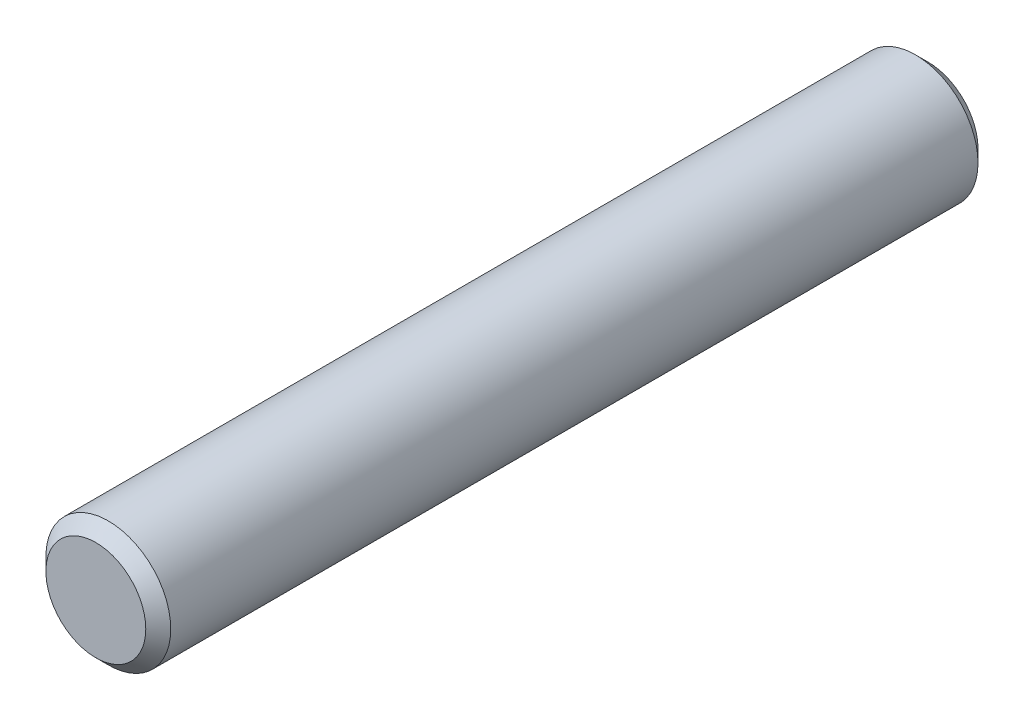
ISO-10303-21;
HEADER;
FILE_DESCRIPTION(('STEP AP214'),'2;1');
FILE_NAME('part.step','',(''),(''),'','','');
FILE_SCHEMA(('AUTOMOTIVE_DESIGN { 1 0 10303 214 1 1 1 1 }'));
ENDSEC;
DATA;
#1=APPLICATION_CONTEXT('core data for automotive mechanical design processes');
#2=APPLICATION_PROTOCOL_DEFINITION('international standard','automotive_design',2000,#1);
#3=PRODUCT_CONTEXT('',#1,'mechanical');
#4=PRODUCT('Part','Part','',(#3));
#5=PRODUCT_RELATED_PRODUCT_CATEGORY('part','',(#4));
#6=PRODUCT_DEFINITION_FORMATION('','',#4);
#7=PRODUCT_DEFINITION_CONTEXT('part definition',#1,'design');
#8=PRODUCT_DEFINITION('design','',#6,#7);
#9=PRODUCT_DEFINITION_SHAPE('','',#8);
#10=(LENGTH_UNIT() NAMED_UNIT(*) SI_UNIT(.MILLI.,.METRE.));
#11=(NAMED_UNIT(*) PLANE_ANGLE_UNIT() SI_UNIT($,.RADIAN.));
#12=(NAMED_UNIT(*) SI_UNIT($,.STERADIAN.) SOLID_ANGLE_UNIT());
#13=UNCERTAINTY_MEASURE_WITH_UNIT(LENGTH_MEASURE(1.E-05),#10,'distance_accuracy_value','');
#14=(GEOMETRIC_REPRESENTATION_CONTEXT(3) GLOBAL_UNCERTAINTY_ASSIGNED_CONTEXT((#13)) GLOBAL_UNIT_ASSIGNED_CONTEXT((#10,
#11,#12)) REPRESENTATION_CONTEXT('',''));
#15=CARTESIAN_POINT('',(0.,0.,0.));
#16=DIRECTION('',(0.,0.,1.));
#17=DIRECTION('',(1.,0.,0.));
#18=AXIS2_PLACEMENT_3D('',#15,#16,#17);
#19=CARTESIAN_POINT('',(0.,0.,10.));
#20=DIRECTION('',(0.,0.,-1.));
#21=DIRECTION('',(-1.,0.,0.));
#22=AXIS2_PLACEMENT_3D('',#19,#20,#21);
#23=CYLINDRICAL_SURFACE('',#22,1.5);
#24=CARTESIAN_POINT('',(0.,0.,-9.7));
#25=DIRECTION('',(0.,0.,1.));
#26=DIRECTION('',(1.,0.,0.));
#27=AXIS2_PLACEMENT_3D('',#24,#25,#26);
#28=CIRCLE('',#27,1.5);
#29=CARTESIAN_POINT('',(1.5,0.,-9.7));
#30=VERTEX_POINT('',#29);
#31=EDGE_CURVE('E53',#30,#30,#28,.T.);
#32=ORIENTED_EDGE('',*,*,#31,.T.);
#33=EDGE_LOOP('',(#32));
#34=FACE_BOUND('',#33,.T.);
#35=CARTESIAN_POINT('',(0.,0.,9.7));
#36=DIRECTION('',(0.,0.,1.));
#37=DIRECTION('',(1.,0.,0.));
#38=AXIS2_PLACEMENT_3D('',#35,#36,#37);
#39=CIRCLE('',#38,1.5);
#40=CARTESIAN_POINT('',(1.5,0.,9.7));
#41=VERTEX_POINT('',#40);
#42=EDGE_CURVE('E58',#41,#41,#39,.F.);
#43=ORIENTED_EDGE('',*,*,#42,.T.);
#44=EDGE_LOOP('',(#43));
#45=FACE_BOUND('',#44,.T.);
#46=ADVANCED_FACE('F39',(#34,#45),#23,.T.);
#47=CARTESIAN_POINT('',(0.,0.,10.));
#48=DIRECTION('',(0.,0.,1.));
#49=DIRECTION('',(1.,0.,0.));
#50=AXIS2_PLACEMENT_3D('',#47,#48,#49);
#51=PLANE('',#50);
#52=CARTESIAN_POINT('',(0.,0.,10.));
#53=DIRECTION('',(0.,0.,1.));
#54=DIRECTION('',(1.,0.,0.));
#55=AXIS2_PLACEMENT_3D('',#52,#53,#54);
#56=CIRCLE('',#55,1.2);
#57=CARTESIAN_POINT('',(1.2,0.,10.));
#58=VERTEX_POINT('',#57);
#59=EDGE_CURVE('E10',#58,#58,#56,.T.);
#60=ORIENTED_EDGE('',*,*,#59,.T.);
#61=EDGE_LOOP('',(#60));
#62=FACE_BOUND('',#61,.T.);
#63=ADVANCED_FACE('F75',(#62),#51,.T.);
#64=CARTESIAN_POINT('',(0.,0.,-10.));
#65=DIRECTION('',(0.,0.,1.));
#66=DIRECTION('',(1.,0.,0.));
#67=AXIS2_PLACEMENT_3D('',#64,#65,#66);
#68=PLANE('',#67);
#69=CARTESIAN_POINT('',(0.,0.,-10.));
#70=DIRECTION('',(0.,0.,1.));
#71=DIRECTION('',(1.,0.,0.));
#72=AXIS2_PLACEMENT_3D('',#69,#70,#71);
#73=CIRCLE('',#72,1.2);
#74=CARTESIAN_POINT('',(1.2,0.,-10.));
#75=VERTEX_POINT('',#74);
#76=EDGE_CURVE('E48',#75,#75,#73,.F.);
#77=ORIENTED_EDGE('',*,*,#76,.T.);
#78=EDGE_LOOP('',(#77));
#79=FACE_BOUND('',#78,.T.);
#80=ADVANCED_FACE('F72',(#79),#68,.F.);
#81=CARTESIAN_POINT('',(0.,0.,-9.7));
#82=DIRECTION('',(0.,0.,1.));
#83=DIRECTION('',(1.,0.,0.));
#84=AXIS2_PLACEMENT_3D('',#81,#82,#83);
#85=CONICAL_SURFACE('',#84,1.5,0.785398163397452);
#86=ORIENTED_EDGE('',*,*,#76,.F.);
#87=EDGE_LOOP('',(#86));
#88=FACE_BOUND('',#87,.T.);
#89=ORIENTED_EDGE('',*,*,#31,.F.);
#90=EDGE_LOOP('',(#89));
#91=FACE_BOUND('',#90,.T.);
#92=ADVANCED_FACE('F68',(#88,#91),#85,.T.);
#93=CARTESIAN_POINT('',(0.,0.,10.));
#94=DIRECTION('',(0.,0.,-1.));
#95=DIRECTION('',(-1.,0.,0.));
#96=AXIS2_PLACEMENT_3D('',#93,#94,#95);
#97=CONICAL_SURFACE('',#96,1.2,0.785398163397447);
#98=ORIENTED_EDGE('',*,*,#42,.F.);
#99=EDGE_LOOP('',(#98));
#100=FACE_BOUND('',#99,.T.);
#101=ORIENTED_EDGE('',*,*,#59,.F.);
#102=EDGE_LOOP('',(#101));
#103=FACE_BOUND('',#102,.T.);
#104=ADVANCED_FACE('F42',(#100,#103),#97,.T.);
#105=CLOSED_SHELL('',(#46,#63,#80,#92,#104));
#106=MANIFOLD_SOLID_BREP('B2',#105);
#107=ADVANCED_BREP_SHAPE_REPRESENTATION('',(#18,#106),#14);
#108=SHAPE_DEFINITION_REPRESENTATION(#9,#107);
ENDSEC;
END-ISO-10303-21;
